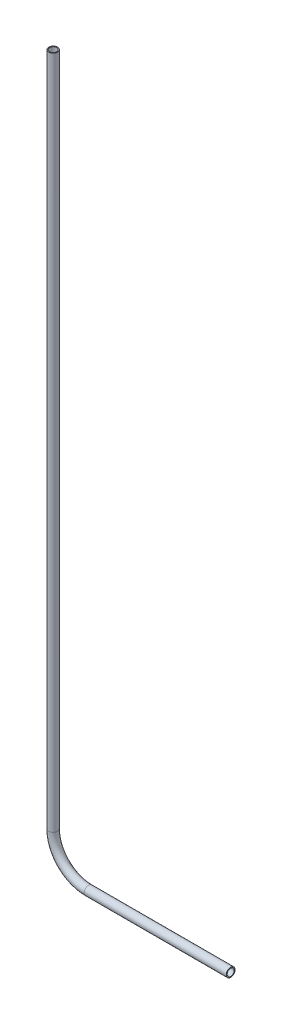
ISO-10303-21;
HEADER;
FILE_DESCRIPTION(('STEP AP214'),'2;1');
FILE_NAME('part.step','',(''),(''),'','','');
FILE_SCHEMA(('AUTOMOTIVE_DESIGN { 1 0 10303 214 1 1 1 1 }'));
ENDSEC;
DATA;
#1=APPLICATION_CONTEXT('core data for automotive mechanical design processes');
#2=APPLICATION_PROTOCOL_DEFINITION('international standard','automotive_design',2000,#1);
#3=PRODUCT_CONTEXT('',#1,'mechanical');
#4=PRODUCT('Part','Part','',(#3));
#5=PRODUCT_RELATED_PRODUCT_CATEGORY('part','',(#4));
#6=PRODUCT_DEFINITION_FORMATION('','',#4);
#7=PRODUCT_DEFINITION_CONTEXT('part definition',#1,'design');
#8=PRODUCT_DEFINITION('design','',#6,#7);
#9=PRODUCT_DEFINITION_SHAPE('','',#8);
#10=(LENGTH_UNIT() NAMED_UNIT(*) SI_UNIT(.MILLI.,.METRE.));
#11=(NAMED_UNIT(*) PLANE_ANGLE_UNIT() SI_UNIT($,.RADIAN.));
#12=(NAMED_UNIT(*) SI_UNIT($,.STERADIAN.) SOLID_ANGLE_UNIT());
#13=UNCERTAINTY_MEASURE_WITH_UNIT(LENGTH_MEASURE(1.E-05),#10,'distance_accuracy_value','');
#14=(GEOMETRIC_REPRESENTATION_CONTEXT(3) GLOBAL_UNCERTAINTY_ASSIGNED_CONTEXT((#13)) GLOBAL_UNIT_ASSIGNED_CONTEXT((#10,
#11,#12)) REPRESENTATION_CONTEXT('',''));
#15=CARTESIAN_POINT('',(0.,0.,0.));
#16=DIRECTION('',(0.,0.,1.));
#17=DIRECTION('',(1.,0.,0.));
#18=AXIS2_PLACEMENT_3D('',#15,#16,#17);
#19=CARTESIAN_POINT('',(0.,-76.2,0.));
#20=DIRECTION('',(0.,-1.,0.));
#21=DIRECTION('',(1.,0.,0.));
#22=AXIS2_PLACEMENT_3D('',#19,#20,#21);
#23=CYLINDRICAL_SURFACE('',#22,3.175);
#24=CARTESIAN_POINT('',(0.,-558.8,0.));
#25=DIRECTION('',(0.,-1.,0.));
#26=DIRECTION('',(1.,0.,0.));
#27=AXIS2_PLACEMENT_3D('',#24,#25,#26);
#28=CIRCLE('',#27,3.175);
#29=CARTESIAN_POINT('',(-3.17499999999992,-558.8,0.));
#30=VERTEX_POINT('',#29);
#31=EDGE_CURVE('E58',#30,#30,#28,.T.);
#32=ORIENTED_EDGE('',*,*,#31,.F.);
#33=EDGE_LOOP('',(#32));
#34=FACE_BOUND('',#33,.T.);
#35=CARTESIAN_POINT('',(0.,-76.2,0.));
#36=DIRECTION('',(0.,-1.,0.));
#37=DIRECTION('',(1.,0.,0.));
#38=AXIS2_PLACEMENT_3D('',#35,#36,#37);
#39=CIRCLE('',#38,3.175);
#40=CARTESIAN_POINT('',(3.17500000000001,-76.2,0.));
#41=VERTEX_POINT('',#40);
#42=EDGE_CURVE('E56',#41,#41,#39,.T.);
#43=ORIENTED_EDGE('',*,*,#42,.T.);
#44=EDGE_LOOP('',(#43));
#45=FACE_BOUND('',#44,.T.);
#46=ADVANCED_FACE('F35',(#34,#45),#23,.T.);
#47=CARTESIAN_POINT('',(25.4000000000001,-558.8,0.));
#48=DIRECTION('',(0.,0.,1.));
#49=DIRECTION('',(1.,0.,0.));
#50=AXIS2_PLACEMENT_3D('',#47,#48,#49);
#51=TOROIDAL_SURFACE('',#50,25.4,3.175);
#52=CARTESIAN_POINT('',(25.4000000000001,-584.2,0.));
#53=DIRECTION('',(1.,0.,0.));
#54=DIRECTION('',(0.,1.,0.));
#55=AXIS2_PLACEMENT_3D('',#52,#53,#54);
#56=CIRCLE('',#55,3.175);
#57=CARTESIAN_POINT('',(25.4000000000001,-587.375,0.));
#58=VERTEX_POINT('',#57);
#59=EDGE_CURVE('E39',#58,#58,#56,.T.);
#60=CARTESIAN_POINT('',(25.4000000000001,-558.8,0.));
#61=DIRECTION('',(0.,0.,1.));
#62=DIRECTION('',(1.,0.,0.));
#63=AXIS2_PLACEMENT_3D('',#60,#61,#62);
#64=CIRCLE('',#63,28.575);
#65=EDGE_CURVE('',#30,#58,#64,.T.);
#66=ORIENTED_EDGE('',*,*,#31,.T.);
#67=ORIENTED_EDGE('',*,*,#59,.F.);
#68=ORIENTED_EDGE('',*,*,#65,.T.);
#69=ORIENTED_EDGE('',*,*,#65,.F.);
#70=EDGE_LOOP('',(#66,#68,#67,#69));
#71=FACE_BOUND('',#70,.T.);
#72=ADVANCED_FACE('F66',(#71),#51,.T.);
#73=CARTESIAN_POINT('',(25.4000000000001,-584.2,0.));
#74=DIRECTION('',(1.,0.,0.));
#75=DIRECTION('',(0.,0.,-1.));
#76=AXIS2_PLACEMENT_3D('',#73,#74,#75);
#77=CYLINDRICAL_SURFACE('',#76,3.175);
#78=CARTESIAN_POINT('',(127.,-584.2,0.));
#79=DIRECTION('',(1.,0.,0.));
#80=DIRECTION('',(0.,1.,0.));
#81=AXIS2_PLACEMENT_3D('',#78,#79,#80);
#82=CIRCLE('',#81,3.175);
#83=CARTESIAN_POINT('',(127.,-581.025,0.));
#84=VERTEX_POINT('',#83);
#85=EDGE_CURVE('E52',#84,#84,#82,.T.);
#86=ORIENTED_EDGE('',*,*,#85,.F.);
#87=EDGE_LOOP('',(#86));
#88=FACE_BOUND('',#87,.T.);
#89=ORIENTED_EDGE('',*,*,#59,.T.);
#90=EDGE_LOOP('',(#89));
#91=FACE_BOUND('',#90,.T.);
#92=ADVANCED_FACE('F37',(#88,#91),#77,.T.);
#93=CARTESIAN_POINT('',(0.,-76.2,0.));
#94=DIRECTION('',(0.,-1.,0.));
#95=DIRECTION('',(1.,0.,0.));
#96=AXIS2_PLACEMENT_3D('',#93,#94,#95);
#97=PLANE('',#96);
#98=CARTESIAN_POINT('',(0.,-76.2,0.));
#99=DIRECTION('',(0.,-1.,0.));
#100=DIRECTION('',(1.,0.,0.));
#101=AXIS2_PLACEMENT_3D('',#98,#99,#100);
#102=CIRCLE('',#101,2.54);
#103=CARTESIAN_POINT('',(2.54000000000001,-76.2,0.));
#104=VERTEX_POINT('',#103);
#105=EDGE_CURVE('E55',#104,#104,#102,.F.);
#106=ORIENTED_EDGE('',*,*,#105,.F.);
#107=EDGE_LOOP('',(#106));
#108=FACE_BOUND('',#107,.T.);
#109=ORIENTED_EDGE('',*,*,#42,.F.);
#110=EDGE_LOOP('',(#109));
#111=FACE_BOUND('',#110,.T.);
#112=ADVANCED_FACE('F72',(#108,#111),#97,.F.);
#113=CARTESIAN_POINT('',(127.,-584.2,0.));
#114=DIRECTION('',(1.,0.,0.));
#115=DIRECTION('',(0.,1.,0.));
#116=AXIS2_PLACEMENT_3D('',#113,#114,#115);
#117=PLANE('',#116);
#118=CARTESIAN_POINT('',(127.,-584.2,0.));
#119=DIRECTION('',(1.,0.,0.));
#120=DIRECTION('',(0.,1.,0.));
#121=AXIS2_PLACEMENT_3D('',#118,#119,#120);
#122=CIRCLE('',#121,2.54);
#123=CARTESIAN_POINT('',(127.,-581.66,0.));
#124=VERTEX_POINT('',#123);
#125=EDGE_CURVE('E10',#124,#124,#122,.F.);
#126=ORIENTED_EDGE('',*,*,#125,.T.);
#127=EDGE_LOOP('',(#126));
#128=FACE_BOUND('',#127,.T.);
#129=ORIENTED_EDGE('',*,*,#85,.T.);
#130=EDGE_LOOP('',(#129));
#131=FACE_BOUND('',#130,.T.);
#132=ADVANCED_FACE('F90',(#128,#131),#117,.T.);
#133=CARTESIAN_POINT('',(0.,-76.2,0.));
#134=DIRECTION('',(0.,-1.,0.));
#135=DIRECTION('',(1.,0.,0.));
#136=AXIS2_PLACEMENT_3D('',#133,#134,#135);
#137=CYLINDRICAL_SURFACE('',#136,2.54);
#138=CARTESIAN_POINT('',(0.,-558.8,0.));
#139=DIRECTION('',(0.,-1.,0.));
#140=DIRECTION('',(1.,0.,0.));
#141=AXIS2_PLACEMENT_3D('',#138,#139,#140);
#142=CIRCLE('',#141,2.54);
#143=CARTESIAN_POINT('',(-2.53999999999992,-558.8,0.));
#144=VERTEX_POINT('',#143);
#145=EDGE_CURVE('E48',#144,#144,#142,.F.);
#146=ORIENTED_EDGE('',*,*,#145,.F.);
#147=EDGE_LOOP('',(#146));
#148=FACE_BOUND('',#147,.T.);
#149=ORIENTED_EDGE('',*,*,#105,.T.);
#150=EDGE_LOOP('',(#149));
#151=FACE_BOUND('',#150,.T.);
#152=ADVANCED_FACE('F84',(#148,#151),#137,.F.);
#153=CARTESIAN_POINT('',(25.4000000000001,-558.8,0.));
#154=DIRECTION('',(0.,0.,1.));
#155=DIRECTION('',(1.,0.,0.));
#156=AXIS2_PLACEMENT_3D('',#153,#154,#155);
#157=TOROIDAL_SURFACE('',#156,25.4,2.54);
#158=CARTESIAN_POINT('',(25.4000000000001,-584.2,0.));
#159=DIRECTION('',(1.,0.,0.));
#160=DIRECTION('',(0.,1.,0.));
#161=AXIS2_PLACEMENT_3D('',#158,#159,#160);
#162=CIRCLE('',#161,2.54);
#163=CARTESIAN_POINT('',(25.4000000000001,-586.74,0.));
#164=VERTEX_POINT('',#163);
#165=EDGE_CURVE('E43',#164,#164,#162,.F.);
#166=CARTESIAN_POINT('',(25.4000000000001,-558.8,0.));
#167=DIRECTION('',(0.,0.,1.));
#168=DIRECTION('',(1.,0.,0.));
#169=AXIS2_PLACEMENT_3D('',#166,#167,#168);
#170=CIRCLE('',#169,27.94);
#171=EDGE_CURVE('',#144,#164,#170,.T.);
#172=ORIENTED_EDGE('',*,*,#145,.T.);
#173=ORIENTED_EDGE('',*,*,#165,.F.);
#174=ORIENTED_EDGE('',*,*,#171,.T.);
#175=ORIENTED_EDGE('',*,*,#171,.F.);
#176=EDGE_LOOP('',(#172,#174,#173,#175));
#177=FACE_BOUND('',#176,.T.);
#178=ADVANCED_FACE('F78',(#177),#157,.F.);
#179=CARTESIAN_POINT('',(25.4000000000001,-584.2,0.));
#180=DIRECTION('',(1.,0.,0.));
#181=DIRECTION('',(0.,0.,-1.));
#182=AXIS2_PLACEMENT_3D('',#179,#180,#181);
#183=CYLINDRICAL_SURFACE('',#182,2.54);
#184=ORIENTED_EDGE('',*,*,#125,.F.);
#185=EDGE_LOOP('',(#184));
#186=FACE_BOUND('',#185,.T.);
#187=ORIENTED_EDGE('',*,*,#165,.T.);
#188=EDGE_LOOP('',(#187));
#189=FACE_BOUND('',#188,.T.);
#190=ADVANCED_FACE('F76',(#186,#189),#183,.F.);
#191=CLOSED_SHELL('',(#46,#72,#92,#112,#132,#152,#178,#190));
#192=MANIFOLD_SOLID_BREP('B2',#191);
#193=ADVANCED_BREP_SHAPE_REPRESENTATION('',(#18,#192),#14);
#194=SHAPE_DEFINITION_REPRESENTATION(#9,#193);
ENDSEC;
END-ISO-10303-21;
